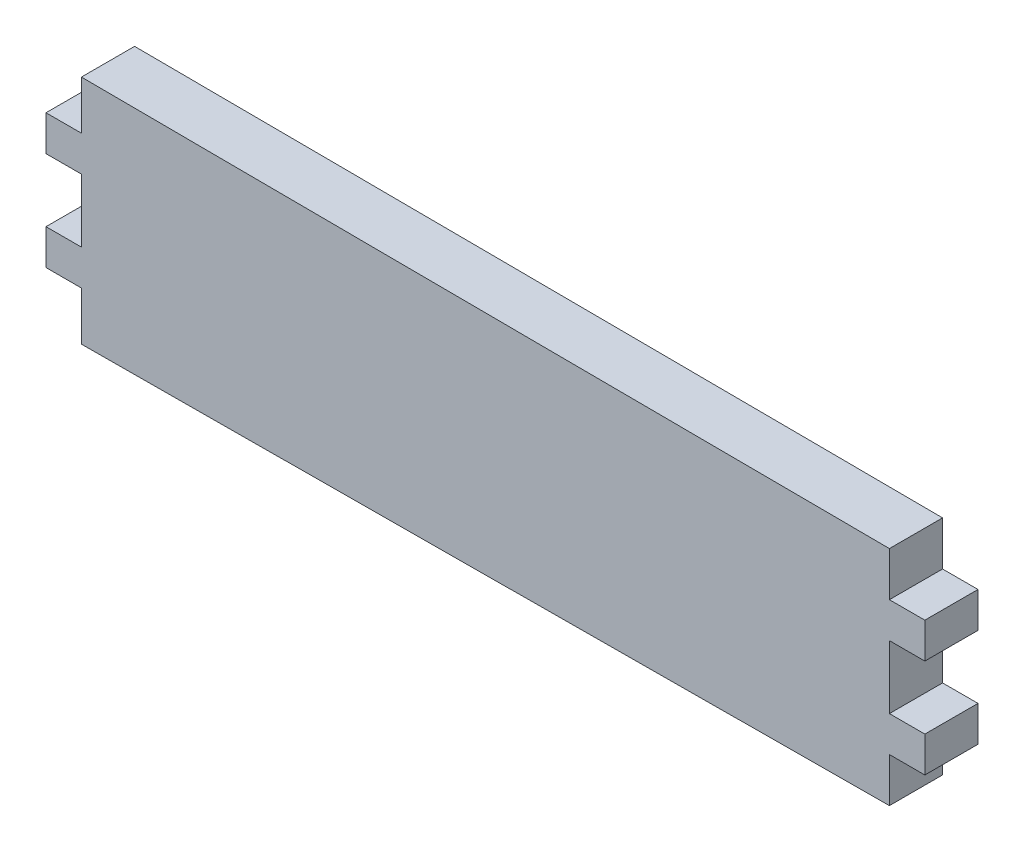
ISO-10303-21;
HEADER;
FILE_DESCRIPTION(('STEP AP214'),'2;1');
FILE_NAME('part.step','',(''),(''),'','','');
FILE_SCHEMA(('AUTOMOTIVE_DESIGN { 1 0 10303 214 1 1 1 1 }'));
ENDSEC;
DATA;
#1=APPLICATION_CONTEXT('core data for automotive mechanical design processes');
#2=APPLICATION_PROTOCOL_DEFINITION('international standard','automotive_design',2000,#1);
#3=PRODUCT_CONTEXT('',#1,'mechanical');
#4=PRODUCT('Part','Part','',(#3));
#5=PRODUCT_RELATED_PRODUCT_CATEGORY('part','',(#4));
#6=PRODUCT_DEFINITION_FORMATION('','',#4);
#7=PRODUCT_DEFINITION_CONTEXT('part definition',#1,'design');
#8=PRODUCT_DEFINITION('design','',#6,#7);
#9=PRODUCT_DEFINITION_SHAPE('','',#8);
#10=(LENGTH_UNIT() NAMED_UNIT(*) SI_UNIT(.MILLI.,.METRE.));
#11=(NAMED_UNIT(*) PLANE_ANGLE_UNIT() SI_UNIT($,.RADIAN.));
#12=(NAMED_UNIT(*) SI_UNIT($,.STERADIAN.) SOLID_ANGLE_UNIT());
#13=UNCERTAINTY_MEASURE_WITH_UNIT(LENGTH_MEASURE(1.E-05),#10,'distance_accuracy_value','');
#14=(GEOMETRIC_REPRESENTATION_CONTEXT(3) GLOBAL_UNCERTAINTY_ASSIGNED_CONTEXT((#13)) GLOBAL_UNIT_ASSIGNED_CONTEXT((#10,
#11,#12)) REPRESENTATION_CONTEXT('',''));
#15=CARTESIAN_POINT('',(0.,0.,0.));
#16=DIRECTION('',(0.,0.,1.));
#17=DIRECTION('',(1.,0.,0.));
#18=AXIS2_PLACEMENT_3D('',#15,#16,#17);
#19=CARTESIAN_POINT('',(220.107868923354,-23.3215057778075,86.1855648606749));
#20=DIRECTION('',(1.,0.,0.));
#21=DIRECTION('',(0.,0.,-1.));
#22=AXIS2_PLACEMENT_3D('',#19,#20,#21);
#23=PLANE('',#22);
#24=DIRECTION('',(0.,-1.,0.));
#25=VECTOR('',#24,1.);
#26=CARTESIAN_POINT('',(220.107868923354,-23.3215057778075,4.7625));
#27=LINE('',#26,#25);
#28=CARTESIAN_POINT('',(220.107868923354,-18.9636843956578,4.7625));
#29=VERTEX_POINT('',#28);
#30=CARTESIAN_POINT('',(220.107868923354,-23.3215057778075,4.76250000000003));
#31=VERTEX_POINT('',#30);
#32=EDGE_CURVE('E239',#29,#31,#27,.T.);
#33=ORIENTED_EDGE('',*,*,#32,.F.);
#34=DIRECTION('',(0.,0.,-1.));
#35=VECTOR('',#34,1.);
#36=CARTESIAN_POINT('',(220.107868923354,-18.9636843956578,86.1855648606749));
#37=LINE('',#36,#35);
#38=CARTESIAN_POINT('',(220.107868923354,-18.9636843956578,0.));
#39=VERTEX_POINT('',#38);
#40=EDGE_CURVE('E36',#29,#39,#37,.T.);
#41=ORIENTED_EDGE('',*,*,#40,.T.);
#42=DIRECTION('',(0.,-1.,0.));
#43=VECTOR('',#42,1.);
#44=CARTESIAN_POINT('',(220.107868923354,-23.3215057778075,0.));
#45=LINE('',#44,#43);
#46=CARTESIAN_POINT('',(220.107868923354,-23.3215057778075,0.));
#47=VERTEX_POINT('',#46);
#48=EDGE_CURVE('E247',#39,#47,#45,.T.);
#49=ORIENTED_EDGE('',*,*,#48,.T.);
#50=DIRECTION('',(0.,0.,-1.));
#51=VECTOR('',#50,1.);
#52=CARTESIAN_POINT('',(220.107868923354,-23.3215057778075,86.1855648606749));
#53=LINE('',#52,#51);
#54=EDGE_CURVE('E135',#31,#47,#53,.T.);
#55=ORIENTED_EDGE('',*,*,#54,.F.);
#56=EDGE_LOOP('',(#33,#41,#49,#55));
#57=FACE_BOUND('',#56,.T.);
#58=ADVANCED_FACE('F32',(#57),#23,.F.);
#59=CARTESIAN_POINT('',(220.107868923354,-23.3215057778075,86.1855648606749));
#60=DIRECTION('',(0.,-1.,0.));
#61=DIRECTION('',(1.,0.,0.));
#62=AXIS2_PLACEMENT_3D('',#59,#60,#61);
#63=PLANE('',#62);
#64=DIRECTION('',(-1.,0.,0.));
#65=VECTOR('',#64,1.);
#66=CARTESIAN_POINT('',(220.107868923354,-23.3215057778075,4.7625));
#67=LINE('',#66,#65);
#68=CARTESIAN_POINT('',(216.932868923354,-23.3215057778075,4.76250000000003));
#69=VERTEX_POINT('',#68);
#70=EDGE_CURVE('E142',#31,#69,#67,.T.);
#71=ORIENTED_EDGE('',*,*,#70,.F.);
#72=ORIENTED_EDGE('',*,*,#54,.T.);
#73=DIRECTION('',(-1.,0.,0.));
#74=VECTOR('',#73,1.);
#75=CARTESIAN_POINT('',(220.107868923354,-23.3215057778075,0.));
#76=LINE('',#75,#74);
#77=CARTESIAN_POINT('',(216.932868923354,-23.3215057778075,0.));
#78=VERTEX_POINT('',#77);
#79=EDGE_CURVE('E246',#47,#78,#76,.T.);
#80=ORIENTED_EDGE('',*,*,#79,.T.);
#81=DIRECTION('',(0.,0.,-1.));
#82=VECTOR('',#81,1.);
#83=CARTESIAN_POINT('',(216.932868923354,-23.3215057778075,86.1855648606749));
#84=LINE('',#83,#82);
#85=EDGE_CURVE('E248',#69,#78,#84,.T.);
#86=ORIENTED_EDGE('',*,*,#85,.F.);
#87=EDGE_LOOP('',(#71,#72,#80,#86));
#88=FACE_BOUND('',#87,.T.);
#89=ADVANCED_FACE('F337',(#88),#63,.F.);
#90=CARTESIAN_POINT('',(216.932868923354,-23.3215057778075,86.1855648606749));
#91=DIRECTION('',(1.,0.,0.));
#92=DIRECTION('',(0.,0.,-1.));
#93=AXIS2_PLACEMENT_3D('',#90,#91,#92);
#94=PLANE('',#93);
#95=DIRECTION('',(0.,-1.,0.));
#96=VECTOR('',#95,1.);
#97=CARTESIAN_POINT('',(216.932868923354,-23.3215057778075,4.7625));
#98=LINE('',#97,#96);
#99=CARTESIAN_POINT('',(216.932868923354,-26.4965057778075,4.76250000000003));
#100=VERTEX_POINT('',#99);
#101=EDGE_CURVE('E235',#69,#100,#98,.T.);
#102=ORIENTED_EDGE('',*,*,#101,.F.);
#103=ORIENTED_EDGE('',*,*,#85,.T.);
#104=DIRECTION('',(0.,-1.,0.));
#105=VECTOR('',#104,1.);
#106=CARTESIAN_POINT('',(216.932868923354,-23.3215057778075,0.));
#107=LINE('',#106,#105);
#108=CARTESIAN_POINT('',(216.932868923354,-26.4965057778075,0.));
#109=VERTEX_POINT('',#108);
#110=EDGE_CURVE('E250',#78,#109,#107,.T.);
#111=ORIENTED_EDGE('',*,*,#110,.T.);
#112=DIRECTION('',(0.,0.,-1.));
#113=VECTOR('',#112,1.);
#114=CARTESIAN_POINT('',(216.932868923354,-26.4965057778075,86.1855648606749));
#115=LINE('',#114,#113);
#116=EDGE_CURVE('E251',#100,#109,#115,.T.);
#117=ORIENTED_EDGE('',*,*,#116,.F.);
#118=EDGE_LOOP('',(#102,#103,#111,#117));
#119=FACE_BOUND('',#118,.T.);
#120=ADVANCED_FACE('F340',(#119),#94,.F.);
#121=CARTESIAN_POINT('',(216.932868923354,-26.4965057778075,86.1855648606749));
#122=DIRECTION('',(0.,1.,0.));
#123=DIRECTION('',(-1.,0.,0.));
#124=AXIS2_PLACEMENT_3D('',#121,#122,#123);
#125=PLANE('',#124);
#126=DIRECTION('',(1.,0.,0.));
#127=VECTOR('',#126,1.);
#128=CARTESIAN_POINT('',(216.932868923354,-26.4965057778075,4.7625));
#129=LINE('',#128,#127);
#130=CARTESIAN_POINT('',(220.107868923354,-26.4965057778075,4.76250000000003));
#131=VERTEX_POINT('',#130);
#132=EDGE_CURVE('E232',#100,#131,#129,.T.);
#133=ORIENTED_EDGE('',*,*,#132,.F.);
#134=ORIENTED_EDGE('',*,*,#116,.T.);
#135=DIRECTION('',(1.,0.,0.));
#136=VECTOR('',#135,1.);
#137=CARTESIAN_POINT('',(216.932868923354,-26.4965057778075,0.));
#138=LINE('',#137,#136);
#139=CARTESIAN_POINT('',(220.107868923354,-26.4965057778075,0.));
#140=VERTEX_POINT('',#139);
#141=EDGE_CURVE('E253',#109,#140,#138,.T.);
#142=ORIENTED_EDGE('',*,*,#141,.T.);
#143=DIRECTION('',(0.,0.,-1.));
#144=VECTOR('',#143,1.);
#145=CARTESIAN_POINT('',(220.107868923354,-26.4965057778075,86.1855648606749));
#146=LINE('',#145,#144);
#147=EDGE_CURVE('E254',#131,#140,#146,.T.);
#148=ORIENTED_EDGE('',*,*,#147,.F.);
#149=EDGE_LOOP('',(#133,#134,#142,#148));
#150=FACE_BOUND('',#149,.T.);
#151=ADVANCED_FACE('F342',(#150),#125,.F.);
#152=CARTESIAN_POINT('',(220.107868923354,-26.4965057778075,86.1855648606749));
#153=DIRECTION('',(1.,0.,0.));
#154=DIRECTION('',(0.,0.,-1.));
#155=AXIS2_PLACEMENT_3D('',#152,#153,#154);
#156=PLANE('',#155);
#157=DIRECTION('',(0.,-1.,0.));
#158=VECTOR('',#157,1.);
#159=CARTESIAN_POINT('',(220.107868923354,-26.4965057778075,4.7625));
#160=LINE('',#159,#158);
#161=CARTESIAN_POINT('',(220.107868923354,-32.1607057778075,4.76250000000003));
#162=VERTEX_POINT('',#161);
#163=EDGE_CURVE('E229',#131,#162,#160,.T.);
#164=ORIENTED_EDGE('',*,*,#163,.F.);
#165=ORIENTED_EDGE('',*,*,#147,.T.);
#166=DIRECTION('',(0.,-1.,0.));
#167=VECTOR('',#166,1.);
#168=CARTESIAN_POINT('',(220.107868923354,-26.4965057778075,0.));
#169=LINE('',#168,#167);
#170=CARTESIAN_POINT('',(220.107868923354,-32.1607057778075,0.));
#171=VERTEX_POINT('',#170);
#172=EDGE_CURVE('E256',#140,#171,#169,.T.);
#173=ORIENTED_EDGE('',*,*,#172,.T.);
#174=DIRECTION('',(0.,0.,-1.));
#175=VECTOR('',#174,1.);
#176=CARTESIAN_POINT('',(220.107868923354,-32.1607057778075,86.1855648606749));
#177=LINE('',#176,#175);
#178=EDGE_CURVE('E257',#162,#171,#177,.T.);
#179=ORIENTED_EDGE('',*,*,#178,.F.);
#180=EDGE_LOOP('',(#164,#165,#173,#179));
#181=FACE_BOUND('',#180,.T.);
#182=ADVANCED_FACE('F346',(#181),#156,.F.);
#183=CARTESIAN_POINT('',(220.107868923354,-32.1607057778075,86.1855648606749));
#184=DIRECTION('',(0.,-1.,0.));
#185=DIRECTION('',(1.,0.,0.));
#186=AXIS2_PLACEMENT_3D('',#183,#184,#185);
#187=PLANE('',#186);
#188=DIRECTION('',(-1.,0.,0.));
#189=VECTOR('',#188,1.);
#190=CARTESIAN_POINT('',(220.107868923354,-32.1607057778075,4.7625));
#191=LINE('',#190,#189);
#192=CARTESIAN_POINT('',(216.932868923354,-32.1607057778075,4.76250000000003));
#193=VERTEX_POINT('',#192);
#194=EDGE_CURVE('E226',#162,#193,#191,.T.);
#195=ORIENTED_EDGE('',*,*,#194,.F.);
#196=ORIENTED_EDGE('',*,*,#178,.T.);
#197=DIRECTION('',(-1.,0.,0.));
#198=VECTOR('',#197,1.);
#199=CARTESIAN_POINT('',(220.107868923354,-32.1607057778075,0.));
#200=LINE('',#199,#198);
#201=CARTESIAN_POINT('',(216.932868923354,-32.1607057778075,0.));
#202=VERTEX_POINT('',#201);
#203=EDGE_CURVE('E259',#171,#202,#200,.T.);
#204=ORIENTED_EDGE('',*,*,#203,.T.);
#205=DIRECTION('',(0.,0.,-1.));
#206=VECTOR('',#205,1.);
#207=CARTESIAN_POINT('',(216.932868923354,-32.1607057778075,86.1855648606749));
#208=LINE('',#207,#206);
#209=EDGE_CURVE('E260',#193,#202,#208,.T.);
#210=ORIENTED_EDGE('',*,*,#209,.F.);
#211=EDGE_LOOP('',(#195,#196,#204,#210));
#212=FACE_BOUND('',#211,.T.);
#213=ADVANCED_FACE('F351',(#212),#187,.F.);
#214=CARTESIAN_POINT('',(216.932868923354,-32.1607057778075,86.1855648606749));
#215=DIRECTION('',(1.,0.,0.));
#216=DIRECTION('',(0.,0.,-1.));
#217=AXIS2_PLACEMENT_3D('',#214,#215,#216);
#218=PLANE('',#217);
#219=DIRECTION('',(0.,-1.,0.));
#220=VECTOR('',#219,1.);
#221=CARTESIAN_POINT('',(216.932868923354,-32.1607057778075,4.7625));
#222=LINE('',#221,#220);
#223=CARTESIAN_POINT('',(216.932868923354,-35.3357057778075,4.76250000000003));
#224=VERTEX_POINT('',#223);
#225=EDGE_CURVE('E223',#193,#224,#222,.T.);
#226=ORIENTED_EDGE('',*,*,#225,.F.);
#227=ORIENTED_EDGE('',*,*,#209,.T.);
#228=DIRECTION('',(0.,-1.,0.));
#229=VECTOR('',#228,1.);
#230=CARTESIAN_POINT('',(216.932868923354,-32.1607057778075,0.));
#231=LINE('',#230,#229);
#232=CARTESIAN_POINT('',(216.932868923354,-35.3357057778075,0.));
#233=VERTEX_POINT('',#232);
#234=EDGE_CURVE('E262',#202,#233,#231,.T.);
#235=ORIENTED_EDGE('',*,*,#234,.T.);
#236=DIRECTION('',(0.,0.,-1.));
#237=VECTOR('',#236,1.);
#238=CARTESIAN_POINT('',(216.932868923354,-35.3357057778075,86.1855648606749));
#239=LINE('',#238,#237);
#240=EDGE_CURVE('E263',#224,#233,#239,.T.);
#241=ORIENTED_EDGE('',*,*,#240,.F.);
#242=EDGE_LOOP('',(#226,#227,#235,#241));
#243=FACE_BOUND('',#242,.T.);
#244=ADVANCED_FACE('F354',(#243),#218,.F.);
#245=CARTESIAN_POINT('',(216.932868923354,-35.3357057778075,86.1855648606749));
#246=DIRECTION('',(0.,1.,0.));
#247=DIRECTION('',(-1.,0.,0.));
#248=AXIS2_PLACEMENT_3D('',#245,#246,#247);
#249=PLANE('',#248);
#250=DIRECTION('',(1.,0.,0.));
#251=VECTOR('',#250,1.);
#252=CARTESIAN_POINT('',(216.932868923354,-35.3357057778075,4.7625));
#253=LINE('',#252,#251);
#254=CARTESIAN_POINT('',(220.107868923354,-35.3357057778075,4.76250000000003));
#255=VERTEX_POINT('',#254);
#256=EDGE_CURVE('E220',#224,#255,#253,.T.);
#257=ORIENTED_EDGE('',*,*,#256,.F.);
#258=ORIENTED_EDGE('',*,*,#240,.T.);
#259=DIRECTION('',(1.,0.,0.));
#260=VECTOR('',#259,1.);
#261=CARTESIAN_POINT('',(216.932868923354,-35.3357057778075,0.));
#262=LINE('',#261,#260);
#263=CARTESIAN_POINT('',(220.107868923354,-35.3357057778075,0.));
#264=VERTEX_POINT('',#263);
#265=EDGE_CURVE('E265',#233,#264,#262,.T.);
#266=ORIENTED_EDGE('',*,*,#265,.T.);
#267=DIRECTION('',(0.,0.,-1.));
#268=VECTOR('',#267,1.);
#269=CARTESIAN_POINT('',(220.107868923354,-35.3357057778075,86.1855648606749));
#270=LINE('',#269,#268);
#271=EDGE_CURVE('E266',#255,#264,#270,.T.);
#272=ORIENTED_EDGE('',*,*,#271,.F.);
#273=EDGE_LOOP('',(#257,#258,#266,#272));
#274=FACE_BOUND('',#273,.T.);
#275=ADVANCED_FACE('F358',(#274),#249,.F.);
#276=CARTESIAN_POINT('',(220.107868923354,-35.3357057778075,86.1855648606749));
#277=DIRECTION('',(1.,0.,0.));
#278=DIRECTION('',(0.,0.,-1.));
#279=AXIS2_PLACEMENT_3D('',#276,#277,#278);
#280=PLANE('',#279);
#281=DIRECTION('',(0.,-1.,0.));
#282=VECTOR('',#281,1.);
#283=CARTESIAN_POINT('',(220.107868923354,-35.3357057778075,4.7625));
#284=LINE('',#283,#282);
#285=CARTESIAN_POINT('',(220.107868923354,-39.6935635874343,4.76250000000003));
#286=VERTEX_POINT('',#285);
#287=EDGE_CURVE('E217',#255,#286,#284,.T.);
#288=ORIENTED_EDGE('',*,*,#287,.F.);
#289=ORIENTED_EDGE('',*,*,#271,.T.);
#290=DIRECTION('',(0.,-1.,0.));
#291=VECTOR('',#290,1.);
#292=CARTESIAN_POINT('',(220.107868923354,-35.3357057778075,0.));
#293=LINE('',#292,#291);
#294=CARTESIAN_POINT('',(220.107868923354,-39.6935635874343,0.));
#295=VERTEX_POINT('',#294);
#296=EDGE_CURVE('E268',#264,#295,#293,.T.);
#297=ORIENTED_EDGE('',*,*,#296,.T.);
#298=DIRECTION('',(0.,0.,-1.));
#299=VECTOR('',#298,1.);
#300=CARTESIAN_POINT('',(220.107868923354,-39.6935635874343,86.1855648606749));
#301=LINE('',#300,#299);
#302=EDGE_CURVE('E269',#286,#295,#301,.T.);
#303=ORIENTED_EDGE('',*,*,#302,.F.);
#304=EDGE_LOOP('',(#288,#289,#297,#303));
#305=FACE_BOUND('',#304,.T.);
#306=ADVANCED_FACE('F363',(#305),#280,.F.);
#307=CARTESIAN_POINT('',(292.497868923354,-39.3024418048071,86.1855648606749));
#308=DIRECTION('',(-0.00540290197401697,0.999985404218611,0.));
#309=DIRECTION('',(-0.999985404218611,-0.00540290197401697,0.));
#310=AXIS2_PLACEMENT_3D('',#307,#308,#309);
#311=PLANE('',#310);
#312=DIRECTION('',(0.999985404218611,0.00540290197401697,0.));
#313=VECTOR('',#312,1.);
#314=CARTESIAN_POINT('',(292.497868923354,-39.3024418048071,4.7625));
#315=LINE('',#314,#313);
#316=CARTESIAN_POINT('',(292.497868923354,-39.3024418048071,4.76250000000003));
#317=VERTEX_POINT('',#316);
#318=EDGE_CURVE('E214',#286,#317,#315,.T.);
#319=ORIENTED_EDGE('',*,*,#318,.F.);
#320=ORIENTED_EDGE('',*,*,#302,.T.);
#321=DIRECTION('',(0.999985404218611,0.00540290197401697,0.));
#322=VECTOR('',#321,1.);
#323=CARTESIAN_POINT('',(292.497868923354,-39.3024418048071,0.));
#324=LINE('',#323,#322);
#325=CARTESIAN_POINT('',(292.497868923354,-39.3024418048071,0.));
#326=VERTEX_POINT('',#325);
#327=EDGE_CURVE('E271',#295,#326,#324,.T.);
#328=ORIENTED_EDGE('',*,*,#327,.T.);
#329=DIRECTION('',(0.,0.,-1.));
#330=VECTOR('',#329,1.);
#331=CARTESIAN_POINT('',(292.497868923354,-39.3024418048071,86.1855648606749));
#332=LINE('',#331,#330);
#333=EDGE_CURVE('E272',#317,#326,#332,.T.);
#334=ORIENTED_EDGE('',*,*,#333,.F.);
#335=EDGE_LOOP('',(#319,#320,#328,#334));
#336=FACE_BOUND('',#335,.T.);
#337=ADVANCED_FACE('F366',(#336),#311,.F.);
#338=CARTESIAN_POINT('',(292.497868923354,-35.3357057778075,86.1855648606749));
#339=DIRECTION('',(-1.,0.,0.));
#340=DIRECTION('',(0.,0.,1.));
#341=AXIS2_PLACEMENT_3D('',#338,#339,#340);
#342=PLANE('',#341);
#343=DIRECTION('',(0.,1.,0.));
#344=VECTOR('',#343,1.);
#345=CARTESIAN_POINT('',(292.497868923354,-35.3357057778075,4.7625));
#346=LINE('',#345,#344);
#347=CARTESIAN_POINT('',(292.497868923354,-35.3357057778075,4.76250000000003));
#348=VERTEX_POINT('',#347);
#349=EDGE_CURVE('E211',#317,#348,#346,.T.);
#350=ORIENTED_EDGE('',*,*,#349,.F.);
#351=ORIENTED_EDGE('',*,*,#333,.T.);
#352=DIRECTION('',(0.,1.,0.));
#353=VECTOR('',#352,1.);
#354=CARTESIAN_POINT('',(292.497868923354,-35.3357057778075,0.));
#355=LINE('',#354,#353);
#356=CARTESIAN_POINT('',(292.497868923354,-35.3357057778075,0.));
#357=VERTEX_POINT('',#356);
#358=EDGE_CURVE('E274',#326,#357,#355,.T.);
#359=ORIENTED_EDGE('',*,*,#358,.T.);
#360=DIRECTION('',(0.,0.,-1.));
#361=VECTOR('',#360,1.);
#362=CARTESIAN_POINT('',(292.497868923354,-35.3357057778075,86.1855648606749));
#363=LINE('',#362,#361);
#364=EDGE_CURVE('E275',#348,#357,#363,.T.);
#365=ORIENTED_EDGE('',*,*,#364,.F.);
#366=EDGE_LOOP('',(#350,#351,#359,#365));
#367=FACE_BOUND('',#366,.T.);
#368=ADVANCED_FACE('F370',(#367),#342,.F.);
#369=CARTESIAN_POINT('',(295.672868923354,-35.3357057778075,86.1855648606749));
#370=DIRECTION('',(0.,1.,0.));
#371=DIRECTION('',(0.,0.,1.));
#372=AXIS2_PLACEMENT_3D('',#369,#370,#371);
#373=PLANE('',#372);
#374=DIRECTION('',(1.,0.,0.));
#375=VECTOR('',#374,1.);
#376=CARTESIAN_POINT('',(295.672868923354,-35.3357057778075,4.7625));
#377=LINE('',#376,#375);
#378=CARTESIAN_POINT('',(295.672868923354,-35.3357057778075,4.76250000000003));
#379=VERTEX_POINT('',#378);
#380=EDGE_CURVE('E208',#348,#379,#377,.T.);
#381=ORIENTED_EDGE('',*,*,#380,.F.);
#382=ORIENTED_EDGE('',*,*,#364,.T.);
#383=DIRECTION('',(1.,0.,0.));
#384=VECTOR('',#383,1.);
#385=CARTESIAN_POINT('',(295.672868923354,-35.3357057778075,0.));
#386=LINE('',#385,#384);
#387=CARTESIAN_POINT('',(295.672868923354,-35.3357057778075,0.));
#388=VERTEX_POINT('',#387);
#389=EDGE_CURVE('E277',#357,#388,#386,.T.);
#390=ORIENTED_EDGE('',*,*,#389,.T.);
#391=DIRECTION('',(0.,0.,-1.));
#392=VECTOR('',#391,1.);
#393=CARTESIAN_POINT('',(295.672868923354,-35.3357057778075,86.1855648606749));
#394=LINE('',#393,#392);
#395=EDGE_CURVE('E278',#379,#388,#394,.T.);
#396=ORIENTED_EDGE('',*,*,#395,.F.);
#397=EDGE_LOOP('',(#381,#382,#390,#396));
#398=FACE_BOUND('',#397,.T.);
#399=ADVANCED_FACE('F375',(#398),#373,.F.);
#400=CARTESIAN_POINT('',(295.672868923354,-32.1607057778075,86.1855648606749));
#401=DIRECTION('',(-1.,0.,0.));
#402=DIRECTION('',(0.,0.,1.));
#403=AXIS2_PLACEMENT_3D('',#400,#401,#402);
#404=PLANE('',#403);
#405=DIRECTION('',(0.,1.,0.));
#406=VECTOR('',#405,1.);
#407=CARTESIAN_POINT('',(295.672868923354,-32.1607057778075,4.7625));
#408=LINE('',#407,#406);
#409=CARTESIAN_POINT('',(295.672868923354,-32.1607057778075,4.76250000000003));
#410=VERTEX_POINT('',#409);
#411=EDGE_CURVE('E205',#379,#410,#408,.T.);
#412=ORIENTED_EDGE('',*,*,#411,.F.);
#413=ORIENTED_EDGE('',*,*,#395,.T.);
#414=DIRECTION('',(0.,1.,0.));
#415=VECTOR('',#414,1.);
#416=CARTESIAN_POINT('',(295.672868923354,-32.1607057778075,0.));
#417=LINE('',#416,#415);
#418=CARTESIAN_POINT('',(295.672868923354,-32.1607057778075,0.));
#419=VERTEX_POINT('',#418);
#420=EDGE_CURVE('E280',#388,#419,#417,.T.);
#421=ORIENTED_EDGE('',*,*,#420,.T.);
#422=DIRECTION('',(0.,0.,-1.));
#423=VECTOR('',#422,1.);
#424=CARTESIAN_POINT('',(295.672868923354,-32.1607057778075,86.1855648606749));
#425=LINE('',#424,#423);
#426=EDGE_CURVE('E281',#410,#419,#425,.T.);
#427=ORIENTED_EDGE('',*,*,#426,.F.);
#428=EDGE_LOOP('',(#412,#413,#421,#427));
#429=FACE_BOUND('',#428,.T.);
#430=ADVANCED_FACE('F378',(#429),#404,.F.);
#431=CARTESIAN_POINT('',(292.497868923354,-32.1607057778075,86.1855648606749));
#432=DIRECTION('',(0.,-1.,0.));
#433=DIRECTION('',(0.,0.,-1.));
#434=AXIS2_PLACEMENT_3D('',#431,#432,#433);
#435=PLANE('',#434);
#436=DIRECTION('',(-1.,0.,0.));
#437=VECTOR('',#436,1.);
#438=CARTESIAN_POINT('',(292.497868923354,-32.1607057778075,4.7625));
#439=LINE('',#438,#437);
#440=CARTESIAN_POINT('',(292.497868923354,-32.1607057778075,4.76250000000003));
#441=VERTEX_POINT('',#440);
#442=EDGE_CURVE('E202',#410,#441,#439,.T.);
#443=ORIENTED_EDGE('',*,*,#442,.F.);
#444=ORIENTED_EDGE('',*,*,#426,.T.);
#445=DIRECTION('',(-1.,0.,0.));
#446=VECTOR('',#445,1.);
#447=CARTESIAN_POINT('',(292.497868923354,-32.1607057778075,0.));
#448=LINE('',#447,#446);
#449=CARTESIAN_POINT('',(292.497868923354,-32.1607057778075,0.));
#450=VERTEX_POINT('',#449);
#451=EDGE_CURVE('E283',#419,#450,#448,.T.);
#452=ORIENTED_EDGE('',*,*,#451,.T.);
#453=DIRECTION('',(0.,0.,-1.));
#454=VECTOR('',#453,1.);
#455=CARTESIAN_POINT('',(292.497868923354,-32.1607057778075,86.1855648606749));
#456=LINE('',#455,#454);
#457=EDGE_CURVE('E284',#441,#450,#456,.T.);
#458=ORIENTED_EDGE('',*,*,#457,.F.);
#459=EDGE_LOOP('',(#443,#444,#452,#458));
#460=FACE_BOUND('',#459,.T.);
#461=ADVANCED_FACE('F382',(#460),#435,.F.);
#462=CARTESIAN_POINT('',(292.497868923354,-26.4965057778075,86.1855648606749));
#463=DIRECTION('',(-1.,0.,0.));
#464=DIRECTION('',(0.,0.,1.));
#465=AXIS2_PLACEMENT_3D('',#462,#463,#464);
#466=PLANE('',#465);
#467=DIRECTION('',(0.,1.,0.));
#468=VECTOR('',#467,1.);
#469=CARTESIAN_POINT('',(292.497868923354,-26.4965057778075,4.7625));
#470=LINE('',#469,#468);
#471=CARTESIAN_POINT('',(292.497868923354,-26.4965057778075,4.76250000000003));
#472=VERTEX_POINT('',#471);
#473=EDGE_CURVE('E199',#441,#472,#470,.T.);
#474=ORIENTED_EDGE('',*,*,#473,.F.);
#475=ORIENTED_EDGE('',*,*,#457,.T.);
#476=DIRECTION('',(0.,1.,0.));
#477=VECTOR('',#476,1.);
#478=CARTESIAN_POINT('',(292.497868923354,-26.4965057778075,0.));
#479=LINE('',#478,#477);
#480=CARTESIAN_POINT('',(292.497868923354,-26.4965057778075,0.));
#481=VERTEX_POINT('',#480);
#482=EDGE_CURVE('E286',#450,#481,#479,.T.);
#483=ORIENTED_EDGE('',*,*,#482,.T.);
#484=DIRECTION('',(0.,0.,-1.));
#485=VECTOR('',#484,1.);
#486=CARTESIAN_POINT('',(292.497868923354,-26.4965057778075,86.1855648606749));
#487=LINE('',#486,#485);
#488=EDGE_CURVE('E287',#472,#481,#487,.T.);
#489=ORIENTED_EDGE('',*,*,#488,.F.);
#490=EDGE_LOOP('',(#474,#475,#483,#489));
#491=FACE_BOUND('',#490,.T.);
#492=ADVANCED_FACE('F387',(#491),#466,.F.);
#493=CARTESIAN_POINT('',(295.672868923354,-26.4965057778075,86.1855648606749));
#494=DIRECTION('',(0.,1.,0.));
#495=DIRECTION('',(0.,0.,1.));
#496=AXIS2_PLACEMENT_3D('',#493,#494,#495);
#497=PLANE('',#496);
#498=DIRECTION('',(1.,0.,0.));
#499=VECTOR('',#498,1.);
#500=CARTESIAN_POINT('',(295.672868923354,-26.4965057778075,4.7625));
#501=LINE('',#500,#499);
#502=CARTESIAN_POINT('',(295.672868923354,-26.4965057778075,4.76250000000003));
#503=VERTEX_POINT('',#502);
#504=EDGE_CURVE('E194',#472,#503,#501,.T.);
#505=ORIENTED_EDGE('',*,*,#504,.F.);
#506=ORIENTED_EDGE('',*,*,#488,.T.);
#507=DIRECTION('',(1.,0.,0.));
#508=VECTOR('',#507,1.);
#509=CARTESIAN_POINT('',(295.672868923354,-26.4965057778075,0.));
#510=LINE('',#509,#508);
#511=CARTESIAN_POINT('',(295.672868923354,-26.4965057778075,0.));
#512=VERTEX_POINT('',#511);
#513=EDGE_CURVE('E289',#481,#512,#510,.T.);
#514=ORIENTED_EDGE('',*,*,#513,.T.);
#515=DIRECTION('',(0.,0.,-1.));
#516=VECTOR('',#515,1.);
#517=CARTESIAN_POINT('',(295.672868923354,-26.4965057778075,86.1855648606749));
#518=LINE('',#517,#516);
#519=EDGE_CURVE('E290',#503,#512,#518,.T.);
#520=ORIENTED_EDGE('',*,*,#519,.F.);
#521=EDGE_LOOP('',(#505,#506,#514,#520));
#522=FACE_BOUND('',#521,.T.);
#523=ADVANCED_FACE('F390',(#522),#497,.F.);
#524=CARTESIAN_POINT('',(295.672868923354,-23.3215057778075,86.1855648606749));
#525=DIRECTION('',(-1.,0.,0.));
#526=DIRECTION('',(0.,0.,1.));
#527=AXIS2_PLACEMENT_3D('',#524,#525,#526);
#528=PLANE('',#527);
#529=DIRECTION('',(0.,1.,0.));
#530=VECTOR('',#529,1.);
#531=CARTESIAN_POINT('',(295.672868923354,-23.3215057778075,4.7625));
#532=LINE('',#531,#530);
#533=CARTESIAN_POINT('',(295.672868923354,-23.3215057778075,4.76250000000003));
#534=VERTEX_POINT('',#533);
#535=EDGE_CURVE('E192',#503,#534,#532,.T.);
#536=ORIENTED_EDGE('',*,*,#535,.F.);
#537=ORIENTED_EDGE('',*,*,#519,.T.);
#538=DIRECTION('',(0.,1.,0.));
#539=VECTOR('',#538,1.);
#540=CARTESIAN_POINT('',(295.672868923354,-23.3215057778075,0.));
#541=LINE('',#540,#539);
#542=CARTESIAN_POINT('',(295.672868923354,-23.3215057778075,0.));
#543=VERTEX_POINT('',#542);
#544=EDGE_CURVE('E292',#512,#543,#541,.T.);
#545=ORIENTED_EDGE('',*,*,#544,.T.);
#546=DIRECTION('',(0.,0.,-1.));
#547=VECTOR('',#546,1.);
#548=CARTESIAN_POINT('',(295.672868923354,-23.3215057778075,86.1855648606749));
#549=LINE('',#548,#547);
#550=EDGE_CURVE('E293',#534,#543,#549,.T.);
#551=ORIENTED_EDGE('',*,*,#550,.F.);
#552=EDGE_LOOP('',(#536,#537,#545,#551));
#553=FACE_BOUND('',#552,.T.);
#554=ADVANCED_FACE('F394',(#553),#528,.F.);
#555=CARTESIAN_POINT('',(292.497868923354,-23.3215057778075,86.1855648606749));
#556=DIRECTION('',(0.,-1.,0.));
#557=DIRECTION('',(0.,0.,-1.));
#558=AXIS2_PLACEMENT_3D('',#555,#556,#557);
#559=PLANE('',#558);
#560=DIRECTION('',(-1.,0.,0.));
#561=VECTOR('',#560,1.);
#562=CARTESIAN_POINT('',(292.497868923354,-23.3215057778075,4.7625));
#563=LINE('',#562,#561);
#564=CARTESIAN_POINT('',(292.497868923354,-23.3215057778075,4.76250000000003));
#565=VERTEX_POINT('',#564);
#566=EDGE_CURVE('E41',#534,#565,#563,.T.);
#567=ORIENTED_EDGE('',*,*,#566,.F.);
#568=ORIENTED_EDGE('',*,*,#550,.T.);
#569=DIRECTION('',(-1.,0.,0.));
#570=VECTOR('',#569,1.);
#571=CARTESIAN_POINT('',(292.497868923354,-23.3215057778075,0.));
#572=LINE('',#571,#570);
#573=CARTESIAN_POINT('',(292.497868923354,-23.3215057778075,0.));
#574=VERTEX_POINT('',#573);
#575=EDGE_CURVE('E186',#543,#574,#572,.T.);
#576=ORIENTED_EDGE('',*,*,#575,.T.);
#577=DIRECTION('',(0.,0.,-1.));
#578=VECTOR('',#577,1.);
#579=CARTESIAN_POINT('',(292.497868923354,-23.3215057778075,86.1855648606749));
#580=LINE('',#579,#578);
#581=EDGE_CURVE('E177',#565,#574,#580,.T.);
#582=ORIENTED_EDGE('',*,*,#581,.F.);
#583=EDGE_LOOP('',(#567,#568,#576,#582));
#584=FACE_BOUND('',#583,.T.);
#585=ADVANCED_FACE('F183',(#584),#559,.F.);
#586=CARTESIAN_POINT('',(292.497868923354,-23.3215057778075,86.1855648606749));
#587=DIRECTION('',(-1.,0.,0.));
#588=DIRECTION('',(0.,0.,1.));
#589=AXIS2_PLACEMENT_3D('',#586,#587,#588);
#590=PLANE('',#589);
#591=DIRECTION('',(0.,1.,0.));
#592=VECTOR('',#591,1.);
#593=CARTESIAN_POINT('',(292.497868923354,-23.3215057778075,4.7625));
#594=LINE('',#593,#592);
#595=CARTESIAN_POINT('',(292.497868923354,-19.3545758629057,4.76250000000003));
#596=VERTEX_POINT('',#595);
#597=EDGE_CURVE('E11',#565,#596,#594,.T.);
#598=ORIENTED_EDGE('',*,*,#597,.F.);
#599=ORIENTED_EDGE('',*,*,#581,.T.);
#600=DIRECTION('',(0.,1.,0.));
#601=VECTOR('',#600,1.);
#602=CARTESIAN_POINT('',(292.497868923354,-23.3215057778075,0.));
#603=LINE('',#602,#601);
#604=CARTESIAN_POINT('',(292.497868923354,-19.3545758629057,0.));
#605=VERTEX_POINT('',#604);
#606=EDGE_CURVE('E188',#574,#605,#603,.T.);
#607=ORIENTED_EDGE('',*,*,#606,.T.);
#608=DIRECTION('',(0.,0.,-1.));
#609=VECTOR('',#608,1.);
#610=CARTESIAN_POINT('',(292.497868923354,-19.3545758629057,86.1855648606749));
#611=LINE('',#610,#609);
#612=EDGE_CURVE('E54',#596,#605,#611,.T.);
#613=ORIENTED_EDGE('',*,*,#612,.F.);
#614=EDGE_LOOP('',(#598,#599,#607,#613));
#615=FACE_BOUND('',#614,.T.);
#616=ADVANCED_FACE('F176',(#615),#590,.F.);
#617=CARTESIAN_POINT('',(292.497868923354,-19.3545758629057,86.1855648606749));
#618=DIRECTION('',(-0.00539972052215347,-0.999985421402874,0.));
#619=DIRECTION('',(0.999985421402873,-0.00539972052215347,0.));
#620=AXIS2_PLACEMENT_3D('',#617,#618,#619);
#621=PLANE('',#620);
#622=DIRECTION('',(-0.999985421402873,0.00539972052215347,0.));
#623=VECTOR('',#622,1.);
#624=CARTESIAN_POINT('',(292.497868923354,-19.3545758629057,4.7625));
#625=LINE('',#624,#623);
#626=EDGE_CURVE('E242',#596,#29,#625,.T.);
#627=ORIENTED_EDGE('',*,*,#626,.F.);
#628=ORIENTED_EDGE('',*,*,#612,.T.);
#629=DIRECTION('',(-0.999985421402873,0.00539972052215347,0.));
#630=VECTOR('',#629,1.);
#631=CARTESIAN_POINT('',(292.497868923354,-19.3545758629057,0.));
#632=LINE('',#631,#630);
#633=EDGE_CURVE('E244',#605,#39,#632,.T.);
#634=ORIENTED_EDGE('',*,*,#633,.T.);
#635=ORIENTED_EDGE('',*,*,#40,.F.);
#636=EDGE_LOOP('',(#627,#628,#634,#635));
#637=FACE_BOUND('',#636,.T.);
#638=ADVANCED_FACE('F332',(#637),#621,.F.);
#639=CARTESIAN_POINT('',(0.,0.,0.));
#640=DIRECTION('',(0.,0.,-1.));
#641=DIRECTION('',(-1.,0.,0.));
#642=AXIS2_PLACEMENT_3D('',#639,#640,#641);
#643=PLANE('',#642);
#644=ORIENTED_EDGE('',*,*,#48,.F.);
#645=ORIENTED_EDGE('',*,*,#633,.F.);
#646=ORIENTED_EDGE('',*,*,#606,.F.);
#647=ORIENTED_EDGE('',*,*,#575,.F.);
#648=ORIENTED_EDGE('',*,*,#544,.F.);
#649=ORIENTED_EDGE('',*,*,#513,.F.);
#650=ORIENTED_EDGE('',*,*,#482,.F.);
#651=ORIENTED_EDGE('',*,*,#451,.F.);
#652=ORIENTED_EDGE('',*,*,#420,.F.);
#653=ORIENTED_EDGE('',*,*,#389,.F.);
#654=ORIENTED_EDGE('',*,*,#358,.F.);
#655=ORIENTED_EDGE('',*,*,#327,.F.);
#656=ORIENTED_EDGE('',*,*,#296,.F.);
#657=ORIENTED_EDGE('',*,*,#265,.F.);
#658=ORIENTED_EDGE('',*,*,#234,.F.);
#659=ORIENTED_EDGE('',*,*,#203,.F.);
#660=ORIENTED_EDGE('',*,*,#172,.F.);
#661=ORIENTED_EDGE('',*,*,#141,.F.);
#662=ORIENTED_EDGE('',*,*,#110,.F.);
#663=ORIENTED_EDGE('',*,*,#79,.F.);
#664=EDGE_LOOP('',(#644,#645,#646,#647,#648,#649,#650,#651,#652,#653,#654,#655,#656,#657,#658,
#659,#660,#661,#662,#663));
#665=FACE_BOUND('',#664,.T.);
#666=ADVANCED_FACE('F334',(#665),#643,.T.);
#667=CARTESIAN_POINT('',(295.79567776537,-35.3357057778075,4.7625));
#668=DIRECTION('',(0.,0.,1.));
#669=DIRECTION('',(1.,0.,0.));
#670=AXIS2_PLACEMENT_3D('',#667,#668,#669);
#671=PLANE('',#670);
#672=ORIENTED_EDGE('',*,*,#626,.T.);
#673=ORIENTED_EDGE('',*,*,#32,.T.);
#674=ORIENTED_EDGE('',*,*,#70,.T.);
#675=ORIENTED_EDGE('',*,*,#101,.T.);
#676=ORIENTED_EDGE('',*,*,#132,.T.);
#677=ORIENTED_EDGE('',*,*,#163,.T.);
#678=ORIENTED_EDGE('',*,*,#194,.T.);
#679=ORIENTED_EDGE('',*,*,#225,.T.);
#680=ORIENTED_EDGE('',*,*,#256,.T.);
#681=ORIENTED_EDGE('',*,*,#287,.T.);
#682=ORIENTED_EDGE('',*,*,#318,.T.);
#683=ORIENTED_EDGE('',*,*,#349,.T.);
#684=ORIENTED_EDGE('',*,*,#380,.T.);
#685=ORIENTED_EDGE('',*,*,#411,.T.);
#686=ORIENTED_EDGE('',*,*,#442,.T.);
#687=ORIENTED_EDGE('',*,*,#473,.T.);
#688=ORIENTED_EDGE('',*,*,#504,.T.);
#689=ORIENTED_EDGE('',*,*,#535,.T.);
#690=ORIENTED_EDGE('',*,*,#566,.T.);
#691=ORIENTED_EDGE('',*,*,#597,.T.);
#692=EDGE_LOOP('',(#672,#673,#674,#675,#676,#677,#678,#679,#680,#681,#682,#683,#684,#685,#686,
#687,#688,#689,#690,#691));
#693=FACE_BOUND('',#692,.T.);
#694=ADVANCED_FACE('F34',(#693),#671,.T.);
#695=CLOSED_SHELL('',(#58,#89,#120,#151,#182,#213,#244,#275,#306,#337,#368,#399,#430,#461,#492,
#523,#554,#585,#616,#638,#666,#694));
#696=MANIFOLD_SOLID_BREP('B2',#695);
#697=ADVANCED_BREP_SHAPE_REPRESENTATION('',(#18,#696),#14);
#698=SHAPE_DEFINITION_REPRESENTATION(#9,#697);
ENDSEC;
END-ISO-10303-21;
